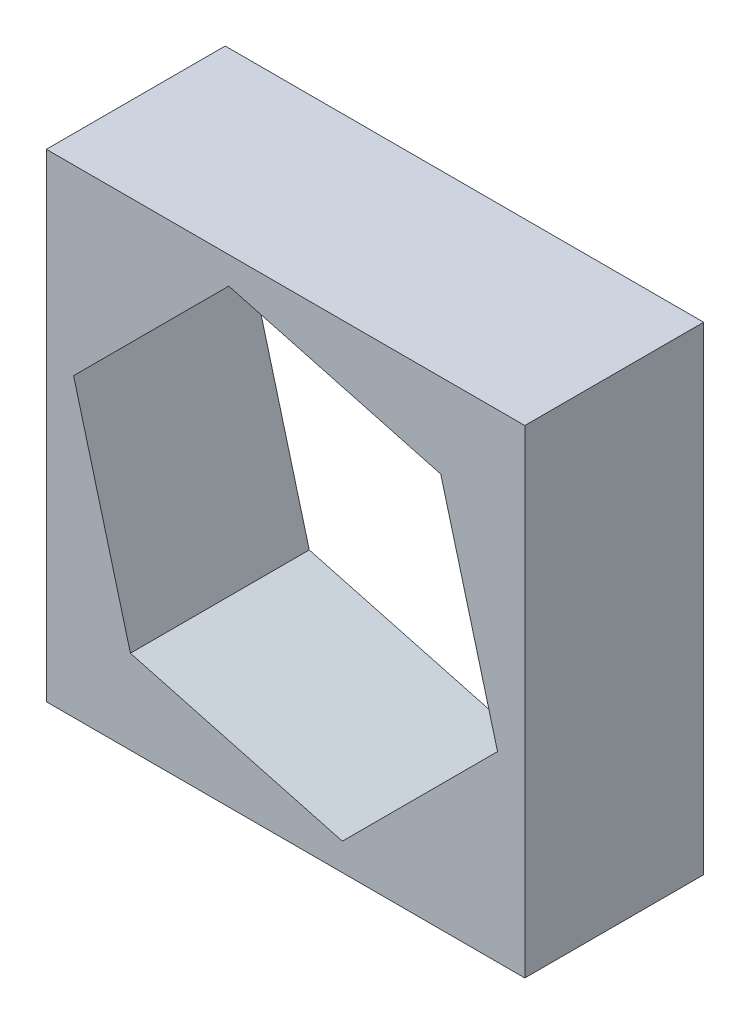
ISO-10303-21;
HEADER;
FILE_DESCRIPTION(('STEP AP214'),'2;1');
FILE_NAME('part.step','',(''),(''),'','','');
FILE_SCHEMA(('AUTOMOTIVE_DESIGN { 1 0 10303 214 1 1 1 1 }'));
ENDSEC;
DATA;
#1=APPLICATION_CONTEXT('core data for automotive mechanical design processes');
#2=APPLICATION_PROTOCOL_DEFINITION('international standard','automotive_design',2000,#1);
#3=PRODUCT_CONTEXT('',#1,'mechanical');
#4=PRODUCT('Part','Part','',(#3));
#5=PRODUCT_RELATED_PRODUCT_CATEGORY('part','',(#4));
#6=PRODUCT_DEFINITION_FORMATION('','',#4);
#7=PRODUCT_DEFINITION_CONTEXT('part definition',#1,'design');
#8=PRODUCT_DEFINITION('design','',#6,#7);
#9=PRODUCT_DEFINITION_SHAPE('','',#8);
#10=(LENGTH_UNIT() NAMED_UNIT(*) SI_UNIT(.MILLI.,.METRE.));
#11=(NAMED_UNIT(*) PLANE_ANGLE_UNIT() SI_UNIT($,.RADIAN.));
#12=(NAMED_UNIT(*) SI_UNIT($,.STERADIAN.) SOLID_ANGLE_UNIT());
#13=UNCERTAINTY_MEASURE_WITH_UNIT(LENGTH_MEASURE(1.E-05),#10,'distance_accuracy_value','');
#14=(GEOMETRIC_REPRESENTATION_CONTEXT(3) GLOBAL_UNCERTAINTY_ASSIGNED_CONTEXT((#13)) GLOBAL_UNIT_ASSIGNED_CONTEXT((#10,
#11,#12)) REPRESENTATION_CONTEXT('',''));
#15=CARTESIAN_POINT('',(0.,0.,0.));
#16=DIRECTION('',(0.,0.,1.));
#17=DIRECTION('',(1.,0.,0.));
#18=AXIS2_PLACEMENT_3D('',#15,#16,#17);
#19=CARTESIAN_POINT('',(0.,0.,8.));
#20=DIRECTION('',(0.,0.,-1.));
#21=DIRECTION('',(-1.,0.,0.));
#22=AXIS2_PLACEMENT_3D('',#19,#20,#21);
#23=PLANE('',#22);
#24=DIRECTION('',(0.,1.,0.));
#25=VECTOR('',#24,1.);
#26=CARTESIAN_POINT('',(10.7,-10.7,8.));
#27=LINE('',#26,#25);
#28=CARTESIAN_POINT('',(10.7,-10.7,8.));
#29=VERTEX_POINT('',#28);
#30=CARTESIAN_POINT('',(10.7,10.7,8.));
#31=VERTEX_POINT('',#30);
#32=EDGE_CURVE('E165',#29,#31,#27,.T.);
#33=ORIENTED_EDGE('',*,*,#32,.T.);
#34=DIRECTION('',(-1.,0.,0.));
#35=VECTOR('',#34,1.);
#36=CARTESIAN_POINT('',(-10.7,10.7,8.));
#37=LINE('',#36,#35);
#38=CARTESIAN_POINT('',(-10.7,10.7,8.));
#39=VERTEX_POINT('',#38);
#40=EDGE_CURVE('E168',#31,#39,#37,.T.);
#41=ORIENTED_EDGE('',*,*,#40,.T.);
#42=DIRECTION('',(0.,-1.,0.));
#43=VECTOR('',#42,1.);
#44=CARTESIAN_POINT('',(-10.7,-10.7,8.));
#45=LINE('',#44,#43);
#46=CARTESIAN_POINT('',(-10.7,-10.7,8.));
#47=VERTEX_POINT('',#46);
#48=EDGE_CURVE('E171',#39,#47,#45,.T.);
#49=ORIENTED_EDGE('',*,*,#48,.T.);
#50=DIRECTION('',(1.,0.,0.));
#51=VECTOR('',#50,1.);
#52=CARTESIAN_POINT('',(-10.7,-10.7,8.));
#53=LINE('',#52,#51);
#54=EDGE_CURVE('E173',#47,#29,#53,.T.);
#55=ORIENTED_EDGE('',*,*,#54,.T.);
#56=EDGE_LOOP('',(#33,#41,#49,#55));
#57=FACE_BOUND('',#56,.T.);
#58=DIRECTION('',(-0.707106781186548,-0.707106781186547,0.));
#59=VECTOR('',#58,1.);
#60=CARTESIAN_POINT('',(-2.54029717114281,9.48051810902851,8.));
#61=LINE('',#60,#59);
#62=CARTESIAN_POINT('',(-2.54029717114281,9.48051810902851,8.));
#63=VERTEX_POINT('',#62);
#64=CARTESIAN_POINT('',(-9.48051810902849,2.54029717114283,8.));
#65=VERTEX_POINT('',#64);
#66=EDGE_CURVE('E114',#63,#65,#61,.T.);
#67=ORIENTED_EDGE('',*,*,#66,.F.);
#68=DIRECTION('',(-0.965925826289068,0.258819045102521,0.));
#69=VECTOR('',#68,1.);
#70=CARTESIAN_POINT('',(6.94022093788568,6.94022093788568,8.));
#71=LINE('',#70,#69);
#72=CARTESIAN_POINT('',(6.94022093788568,6.94022093788568,8.));
#73=VERTEX_POINT('',#72);
#74=EDGE_CURVE('E143',#73,#63,#71,.T.);
#75=ORIENTED_EDGE('',*,*,#74,.F.);
#76=DIRECTION('',(-0.25881904510252,0.965925826289068,0.));
#77=VECTOR('',#76,1.);
#78=CARTESIAN_POINT('',(9.4805181090285,-2.54029717114282,8.));
#79=LINE('',#78,#77);
#80=CARTESIAN_POINT('',(9.4805181090285,-2.54029717114282,8.));
#81=VERTEX_POINT('',#80);
#82=EDGE_CURVE('E141',#81,#73,#79,.T.);
#83=ORIENTED_EDGE('',*,*,#82,.F.);
#84=DIRECTION('',(0.707106781186548,0.707106781186547,0.));
#85=VECTOR('',#84,1.);
#86=CARTESIAN_POINT('',(2.54029717114282,-9.4805181090285,8.));
#87=LINE('',#86,#85);
#88=CARTESIAN_POINT('',(2.54029717114282,-9.4805181090285,8.));
#89=VERTEX_POINT('',#88);
#90=EDGE_CURVE('E137',#89,#81,#87,.T.);
#91=ORIENTED_EDGE('',*,*,#90,.F.);
#92=DIRECTION('',(0.965925826289068,-0.258819045102522,0.));
#93=VECTOR('',#92,1.);
#94=CARTESIAN_POINT('',(-6.94022093788568,-6.94022093788567,8.));
#95=LINE('',#94,#93);
#96=CARTESIAN_POINT('',(-6.94022093788568,-6.94022093788567,8.));
#97=VERTEX_POINT('',#96);
#98=EDGE_CURVE('E135',#97,#89,#95,.T.);
#99=ORIENTED_EDGE('',*,*,#98,.F.);
#100=DIRECTION('',(0.25881904510252,-0.965925826289069,0.));
#101=VECTOR('',#100,1.);
#102=CARTESIAN_POINT('',(-9.48051810902849,2.54029717114283,8.));
#103=LINE('',#102,#101);
#104=EDGE_CURVE('E122',#65,#97,#103,.T.);
#105=ORIENTED_EDGE('',*,*,#104,.F.);
#106=EDGE_LOOP('',(#67,#75,#83,#91,#99,#105));
#107=FACE_BOUND('',#106,.T.);
#108=ADVANCED_FACE('F37',(#57,#107),#23,.F.);
#109=CARTESIAN_POINT('',(0.,0.,0.));
#110=DIRECTION('',(0.,0.,-1.));
#111=DIRECTION('',(-1.,0.,0.));
#112=AXIS2_PLACEMENT_3D('',#109,#110,#111);
#113=PLANE('',#112);
#114=DIRECTION('',(0.,1.,0.));
#115=VECTOR('',#114,1.);
#116=CARTESIAN_POINT('',(10.7,-10.7,0.));
#117=LINE('',#116,#115);
#118=CARTESIAN_POINT('',(10.7,-10.7,0.));
#119=VERTEX_POINT('',#118);
#120=CARTESIAN_POINT('',(10.7,10.7,0.));
#121=VERTEX_POINT('',#120);
#122=EDGE_CURVE('E130',#119,#121,#117,.T.);
#123=ORIENTED_EDGE('',*,*,#122,.F.);
#124=DIRECTION('',(1.,0.,0.));
#125=VECTOR('',#124,1.);
#126=CARTESIAN_POINT('',(-10.7,-10.7,0.));
#127=LINE('',#126,#125);
#128=CARTESIAN_POINT('',(-10.7,-10.7,0.));
#129=VERTEX_POINT('',#128);
#130=EDGE_CURVE('E169',#129,#119,#127,.T.);
#131=ORIENTED_EDGE('',*,*,#130,.F.);
#132=DIRECTION('',(0.,-1.,0.));
#133=VECTOR('',#132,1.);
#134=CARTESIAN_POINT('',(-10.7,-10.7,0.));
#135=LINE('',#134,#133);
#136=CARTESIAN_POINT('',(-10.7,10.7,0.));
#137=VERTEX_POINT('',#136);
#138=EDGE_CURVE('E180',#137,#129,#135,.T.);
#139=ORIENTED_EDGE('',*,*,#138,.F.);
#140=DIRECTION('',(-1.,0.,0.));
#141=VECTOR('',#140,1.);
#142=CARTESIAN_POINT('',(-10.7,10.7,0.));
#143=LINE('',#142,#141);
#144=EDGE_CURVE('E178',#121,#137,#143,.T.);
#145=ORIENTED_EDGE('',*,*,#144,.F.);
#146=EDGE_LOOP('',(#123,#131,#139,#145));
#147=FACE_BOUND('',#146,.T.);
#148=DIRECTION('',(-0.965925826289068,0.258819045102521,0.));
#149=VECTOR('',#148,1.);
#150=CARTESIAN_POINT('',(6.94022093788568,6.94022093788568,0.));
#151=LINE('',#150,#149);
#152=CARTESIAN_POINT('',(6.94022093788568,6.94022093788568,0.));
#153=VERTEX_POINT('',#152);
#154=CARTESIAN_POINT('',(-2.54029717114281,9.48051810902851,0.));
#155=VERTEX_POINT('',#154);
#156=EDGE_CURVE('E123',#153,#155,#151,.T.);
#157=ORIENTED_EDGE('',*,*,#156,.T.);
#158=DIRECTION('',(-0.707106781186548,-0.707106781186547,0.));
#159=VECTOR('',#158,1.);
#160=CARTESIAN_POINT('',(-2.54029717114281,9.48051810902851,0.));
#161=LINE('',#160,#159);
#162=CARTESIAN_POINT('',(-9.48051810902849,2.54029717114283,0.));
#163=VERTEX_POINT('',#162);
#164=EDGE_CURVE('E60',#155,#163,#161,.T.);
#165=ORIENTED_EDGE('',*,*,#164,.T.);
#166=DIRECTION('',(0.25881904510252,-0.965925826289069,0.));
#167=VECTOR('',#166,1.);
#168=CARTESIAN_POINT('',(-9.48051810902849,2.54029717114283,0.));
#169=LINE('',#168,#167);
#170=CARTESIAN_POINT('',(-6.94022093788568,-6.94022093788567,0.));
#171=VERTEX_POINT('',#170);
#172=EDGE_CURVE('E129',#163,#171,#169,.T.);
#173=ORIENTED_EDGE('',*,*,#172,.T.);
#174=DIRECTION('',(0.965925826289068,-0.258819045102522,0.));
#175=VECTOR('',#174,1.);
#176=CARTESIAN_POINT('',(-6.94022093788568,-6.94022093788567,0.));
#177=LINE('',#176,#175);
#178=CARTESIAN_POINT('',(2.54029717114282,-9.4805181090285,0.));
#179=VERTEX_POINT('',#178);
#180=EDGE_CURVE('E147',#171,#179,#177,.T.);
#181=ORIENTED_EDGE('',*,*,#180,.T.);
#182=DIRECTION('',(0.707106781186548,0.707106781186547,0.));
#183=VECTOR('',#182,1.);
#184=CARTESIAN_POINT('',(2.54029717114282,-9.4805181090285,0.));
#185=LINE('',#184,#183);
#186=CARTESIAN_POINT('',(9.4805181090285,-2.54029717114282,0.));
#187=VERTEX_POINT('',#186);
#188=EDGE_CURVE('E150',#179,#187,#185,.T.);
#189=ORIENTED_EDGE('',*,*,#188,.T.);
#190=DIRECTION('',(-0.25881904510252,0.965925826289068,0.));
#191=VECTOR('',#190,1.);
#192=CARTESIAN_POINT('',(9.4805181090285,-2.54029717114282,0.));
#193=LINE('',#192,#191);
#194=EDGE_CURVE('E153',#187,#153,#193,.T.);
#195=ORIENTED_EDGE('',*,*,#194,.T.);
#196=EDGE_LOOP('',(#157,#165,#173,#181,#189,#195));
#197=FACE_BOUND('',#196,.T.);
#198=ADVANCED_FACE('F198',(#147,#197),#113,.T.);
#199=CARTESIAN_POINT('',(10.7,-10.7,8.));
#200=DIRECTION('',(-1.,0.,0.));
#201=DIRECTION('',(0.,0.,1.));
#202=AXIS2_PLACEMENT_3D('',#199,#200,#201);
#203=PLANE('',#202);
#204=ORIENTED_EDGE('',*,*,#122,.T.);
#205=DIRECTION('',(0.,0.,-1.));
#206=VECTOR('',#205,1.);
#207=CARTESIAN_POINT('',(10.7,10.7,8.));
#208=LINE('',#207,#206);
#209=EDGE_CURVE('E11',#31,#121,#208,.T.);
#210=ORIENTED_EDGE('',*,*,#209,.F.);
#211=ORIENTED_EDGE('',*,*,#32,.F.);
#212=DIRECTION('',(0.,0.,-1.));
#213=VECTOR('',#212,1.);
#214=CARTESIAN_POINT('',(10.7,-10.7,8.));
#215=LINE('',#214,#213);
#216=EDGE_CURVE('E175',#29,#119,#215,.T.);
#217=ORIENTED_EDGE('',*,*,#216,.T.);
#218=EDGE_LOOP('',(#204,#210,#211,#217));
#219=FACE_BOUND('',#218,.T.);
#220=ADVANCED_FACE('F39',(#219),#203,.F.);
#221=CARTESIAN_POINT('',(-10.7,10.7,8.));
#222=DIRECTION('',(0.,-1.,0.));
#223=DIRECTION('',(0.,0.,-1.));
#224=AXIS2_PLACEMENT_3D('',#221,#222,#223);
#225=PLANE('',#224);
#226=ORIENTED_EDGE('',*,*,#144,.T.);
#227=DIRECTION('',(0.,0.,-1.));
#228=VECTOR('',#227,1.);
#229=CARTESIAN_POINT('',(-10.7,10.7,8.));
#230=LINE('',#229,#228);
#231=EDGE_CURVE('E45',#39,#137,#230,.T.);
#232=ORIENTED_EDGE('',*,*,#231,.F.);
#233=ORIENTED_EDGE('',*,*,#40,.F.);
#234=ORIENTED_EDGE('',*,*,#209,.T.);
#235=EDGE_LOOP('',(#226,#232,#233,#234));
#236=FACE_BOUND('',#235,.T.);
#237=ADVANCED_FACE('F208',(#236),#225,.F.);
#238=CARTESIAN_POINT('',(-10.7,-10.7,8.));
#239=DIRECTION('',(1.,0.,0.));
#240=DIRECTION('',(0.,0.,-1.));
#241=AXIS2_PLACEMENT_3D('',#238,#239,#240);
#242=PLANE('',#241);
#243=ORIENTED_EDGE('',*,*,#138,.T.);
#244=DIRECTION('',(0.,0.,-1.));
#245=VECTOR('',#244,1.);
#246=CARTESIAN_POINT('',(-10.7,-10.7,8.));
#247=LINE('',#246,#245);
#248=EDGE_CURVE('E185',#47,#129,#247,.T.);
#249=ORIENTED_EDGE('',*,*,#248,.F.);
#250=ORIENTED_EDGE('',*,*,#48,.F.);
#251=ORIENTED_EDGE('',*,*,#231,.T.);
#252=EDGE_LOOP('',(#243,#249,#250,#251));
#253=FACE_BOUND('',#252,.T.);
#254=ADVANCED_FACE('F192',(#253),#242,.F.);
#255=CARTESIAN_POINT('',(-10.7,-10.7,8.));
#256=DIRECTION('',(0.,1.,0.));
#257=DIRECTION('',(0.,0.,1.));
#258=AXIS2_PLACEMENT_3D('',#255,#256,#257);
#259=PLANE('',#258);
#260=ORIENTED_EDGE('',*,*,#130,.T.);
#261=ORIENTED_EDGE('',*,*,#216,.F.);
#262=ORIENTED_EDGE('',*,*,#54,.F.);
#263=ORIENTED_EDGE('',*,*,#248,.T.);
#264=EDGE_LOOP('',(#260,#261,#262,#263));
#265=FACE_BOUND('',#264,.T.);
#266=ADVANCED_FACE('F202',(#265),#259,.F.);
#267=CARTESIAN_POINT('',(-2.54029717114281,9.48051810902851,8.));
#268=DIRECTION('',(0.707106781186547,-0.707106781186548,0.));
#269=DIRECTION('',(0.707106781186548,0.707106781186547,0.));
#270=AXIS2_PLACEMENT_3D('',#267,#268,#269);
#271=PLANE('',#270);
#272=ORIENTED_EDGE('',*,*,#164,.F.);
#273=DIRECTION('',(0.,0.,-1.));
#274=VECTOR('',#273,1.);
#275=CARTESIAN_POINT('',(-2.54029717114281,9.48051810902851,8.));
#276=LINE('',#275,#274);
#277=EDGE_CURVE('E118',#63,#155,#276,.T.);
#278=ORIENTED_EDGE('',*,*,#277,.F.);
#279=ORIENTED_EDGE('',*,*,#66,.T.);
#280=DIRECTION('',(0.,0.,-1.));
#281=VECTOR('',#280,1.);
#282=CARTESIAN_POINT('',(-9.48051810902849,2.54029717114283,8.));
#283=LINE('',#282,#281);
#284=EDGE_CURVE('E117',#65,#163,#283,.T.);
#285=ORIENTED_EDGE('',*,*,#284,.T.);
#286=EDGE_LOOP('',(#272,#278,#279,#285));
#287=FACE_BOUND('',#286,.T.);
#288=ADVANCED_FACE('F116',(#287),#271,.T.);
#289=CARTESIAN_POINT('',(-9.48051810902849,2.54029717114283,8.));
#290=DIRECTION('',(0.965925826289068,0.25881904510252,0.));
#291=DIRECTION('',(-0.25881904510252,0.965925826289068,0.));
#292=AXIS2_PLACEMENT_3D('',#289,#290,#291);
#293=PLANE('',#292);
#294=ORIENTED_EDGE('',*,*,#172,.F.);
#295=ORIENTED_EDGE('',*,*,#284,.F.);
#296=ORIENTED_EDGE('',*,*,#104,.T.);
#297=DIRECTION('',(0.,0.,-1.));
#298=VECTOR('',#297,1.);
#299=CARTESIAN_POINT('',(-6.94022093788568,-6.94022093788567,8.));
#300=LINE('',#299,#298);
#301=EDGE_CURVE('E131',#97,#171,#300,.T.);
#302=ORIENTED_EDGE('',*,*,#301,.T.);
#303=EDGE_LOOP('',(#294,#295,#296,#302));
#304=FACE_BOUND('',#303,.T.);
#305=ADVANCED_FACE('F126',(#304),#293,.T.);
#306=CARTESIAN_POINT('',(-6.94022093788568,-6.94022093788567,8.));
#307=DIRECTION('',(0.258819045102522,0.965925826289068,0.));
#308=DIRECTION('',(-0.965925826289068,0.258819045102522,0.));
#309=AXIS2_PLACEMENT_3D('',#306,#307,#308);
#310=PLANE('',#309);
#311=ORIENTED_EDGE('',*,*,#180,.F.);
#312=ORIENTED_EDGE('',*,*,#301,.F.);
#313=ORIENTED_EDGE('',*,*,#98,.T.);
#314=DIRECTION('',(0.,0.,-1.));
#315=VECTOR('',#314,1.);
#316=CARTESIAN_POINT('',(2.54029717114282,-9.4805181090285,8.));
#317=LINE('',#316,#315);
#318=EDGE_CURVE('E162',#89,#179,#317,.T.);
#319=ORIENTED_EDGE('',*,*,#318,.T.);
#320=EDGE_LOOP('',(#311,#312,#313,#319));
#321=FACE_BOUND('',#320,.T.);
#322=ADVANCED_FACE('F231',(#321),#310,.T.);
#323=CARTESIAN_POINT('',(2.54029717114282,-9.4805181090285,8.));
#324=DIRECTION('',(-0.707106781186547,0.707106781186548,0.));
#325=DIRECTION('',(-0.707106781186548,-0.707106781186547,0.));
#326=AXIS2_PLACEMENT_3D('',#323,#324,#325);
#327=PLANE('',#326);
#328=ORIENTED_EDGE('',*,*,#188,.F.);
#329=ORIENTED_EDGE('',*,*,#318,.F.);
#330=ORIENTED_EDGE('',*,*,#90,.T.);
#331=DIRECTION('',(0.,0.,-1.));
#332=VECTOR('',#331,1.);
#333=CARTESIAN_POINT('',(9.4805181090285,-2.54029717114282,8.));
#334=LINE('',#333,#332);
#335=EDGE_CURVE('E160',#81,#187,#334,.T.);
#336=ORIENTED_EDGE('',*,*,#335,.T.);
#337=EDGE_LOOP('',(#328,#329,#330,#336));
#338=FACE_BOUND('',#337,.T.);
#339=ADVANCED_FACE('F235',(#338),#327,.T.);
#340=CARTESIAN_POINT('',(9.4805181090285,-2.54029717114282,8.));
#341=DIRECTION('',(-0.965925826289069,-0.25881904510252,0.));
#342=DIRECTION('',(0.25881904510252,-0.965925826289069,0.));
#343=AXIS2_PLACEMENT_3D('',#340,#341,#342);
#344=PLANE('',#343);
#345=ORIENTED_EDGE('',*,*,#194,.F.);
#346=ORIENTED_EDGE('',*,*,#335,.F.);
#347=ORIENTED_EDGE('',*,*,#82,.T.);
#348=DIRECTION('',(0.,0.,-1.));
#349=VECTOR('',#348,1.);
#350=CARTESIAN_POINT('',(6.94022093788568,6.94022093788568,8.));
#351=LINE('',#350,#349);
#352=EDGE_CURVE('E52',#73,#153,#351,.T.);
#353=ORIENTED_EDGE('',*,*,#352,.T.);
#354=EDGE_LOOP('',(#345,#346,#347,#353));
#355=FACE_BOUND('',#354,.T.);
#356=ADVANCED_FACE('F241',(#355),#344,.T.);
#357=CARTESIAN_POINT('',(6.94022093788568,6.94022093788568,8.));
#358=DIRECTION('',(-0.258819045102521,-0.965925826289068,0.));
#359=DIRECTION('',(0.965925826289068,-0.258819045102521,0.));
#360=AXIS2_PLACEMENT_3D('',#357,#358,#359);
#361=PLANE('',#360);
#362=ORIENTED_EDGE('',*,*,#156,.F.);
#363=ORIENTED_EDGE('',*,*,#352,.F.);
#364=ORIENTED_EDGE('',*,*,#74,.T.);
#365=ORIENTED_EDGE('',*,*,#277,.T.);
#366=EDGE_LOOP('',(#362,#363,#364,#365));
#367=FACE_BOUND('',#366,.T.);
#368=ADVANCED_FACE('F245',(#367),#361,.T.);
#369=CLOSED_SHELL('',(#108,#198,#220,#237,#254,#266,#288,#305,#322,#339,#356,#368));
#370=MANIFOLD_SOLID_BREP('B2',#369);
#371=ADVANCED_BREP_SHAPE_REPRESENTATION('',(#18,#370),#14);
#372=SHAPE_DEFINITION_REPRESENTATION(#9,#371);
ENDSEC;
END-ISO-10303-21;
